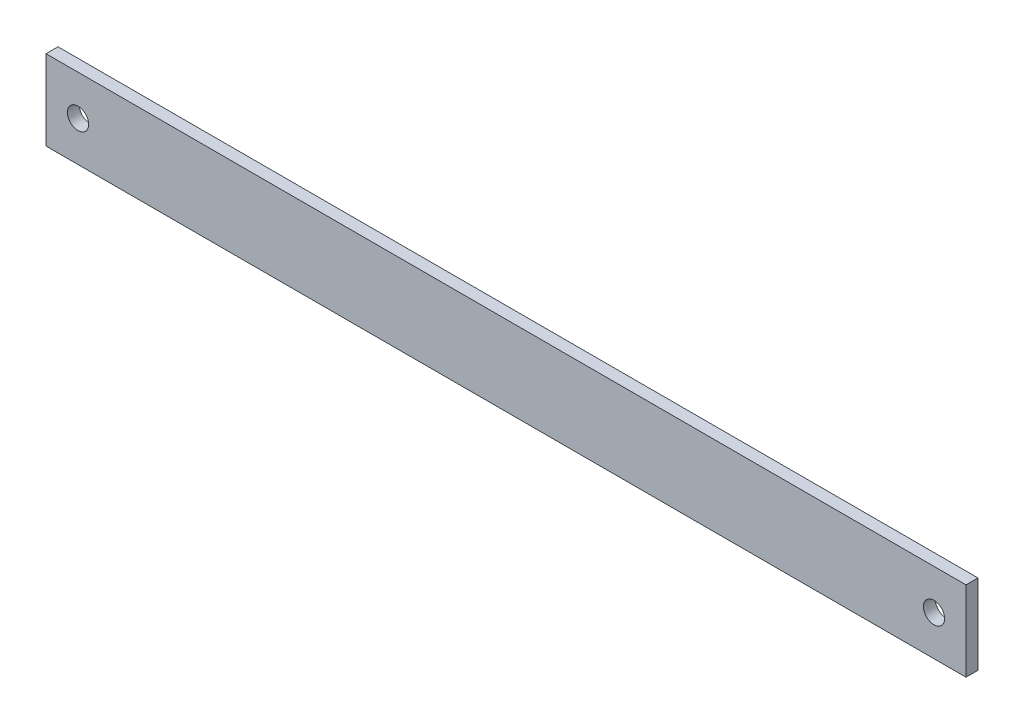
ISO-10303-21;
HEADER;
FILE_DESCRIPTION(('STEP AP214'),'2;1');
FILE_NAME('part.step','',(''),(''),'','','');
FILE_SCHEMA(('AUTOMOTIVE_DESIGN { 1 0 10303 214 1 1 1 1 }'));
ENDSEC;
DATA;
#1=APPLICATION_CONTEXT('core data for automotive mechanical design processes');
#2=APPLICATION_PROTOCOL_DEFINITION('international standard','automotive_design',2000,#1);
#3=PRODUCT_CONTEXT('',#1,'mechanical');
#4=PRODUCT('Part','Part','',(#3));
#5=PRODUCT_RELATED_PRODUCT_CATEGORY('part','',(#4));
#6=PRODUCT_DEFINITION_FORMATION('','',#4);
#7=PRODUCT_DEFINITION_CONTEXT('part definition',#1,'design');
#8=PRODUCT_DEFINITION('design','',#6,#7);
#9=PRODUCT_DEFINITION_SHAPE('','',#8);
#10=(LENGTH_UNIT() NAMED_UNIT(*) SI_UNIT(.MILLI.,.METRE.));
#11=(NAMED_UNIT(*) PLANE_ANGLE_UNIT() SI_UNIT($,.RADIAN.));
#12=(NAMED_UNIT(*) SI_UNIT($,.STERADIAN.) SOLID_ANGLE_UNIT());
#13=UNCERTAINTY_MEASURE_WITH_UNIT(LENGTH_MEASURE(1.E-05),#10,'distance_accuracy_value','');
#14=(GEOMETRIC_REPRESENTATION_CONTEXT(3) GLOBAL_UNCERTAINTY_ASSIGNED_CONTEXT((#13)) GLOBAL_UNIT_ASSIGNED_CONTEXT((#10,
#11,#12)) REPRESENTATION_CONTEXT('',''));
#15=CARTESIAN_POINT('',(0.,0.,0.));
#16=DIRECTION('',(0.,0.,1.));
#17=DIRECTION('',(1.,0.,0.));
#18=AXIS2_PLACEMENT_3D('',#15,#16,#17);
#19=CARTESIAN_POINT('',(-21.25,17.5,-3.));
#20=DIRECTION('',(0.,1.,0.));
#21=DIRECTION('',(-1.,0.,0.));
#22=AXIS2_PLACEMENT_3D('',#19,#20,#21);
#23=PLANE('',#22);
#24=DIRECTION('',(-1.,0.,0.));
#25=VECTOR('',#24,1.);
#26=CARTESIAN_POINT('',(-21.25,17.5,0.));
#27=LINE('',#26,#25);
#28=CARTESIAN_POINT('',(208.75,17.5000000000001,0.));
#29=VERTEX_POINT('',#28);
#30=CARTESIAN_POINT('',(-21.25,17.5,0.));
#31=VERTEX_POINT('',#30);
#32=EDGE_CURVE('E99',#29,#31,#27,.T.);
#33=ORIENTED_EDGE('',*,*,#32,.F.);
#34=DIRECTION('',(0.,0.,1.));
#35=VECTOR('',#34,1.);
#36=CARTESIAN_POINT('',(208.75,17.5000000000001,-3.));
#37=LINE('',#36,#35);
#38=CARTESIAN_POINT('',(208.75,17.5000000000001,-3.));
#39=VERTEX_POINT('',#38);
#40=EDGE_CURVE('E11',#39,#29,#37,.T.);
#41=ORIENTED_EDGE('',*,*,#40,.F.);
#42=DIRECTION('',(-1.,0.,0.));
#43=VECTOR('',#42,1.);
#44=CARTESIAN_POINT('',(-21.25,17.5,-3.));
#45=LINE('',#44,#43);
#46=CARTESIAN_POINT('',(-21.25,17.5,-3.));
#47=VERTEX_POINT('',#46);
#48=EDGE_CURVE('E92',#39,#47,#45,.T.);
#49=ORIENTED_EDGE('',*,*,#48,.T.);
#50=DIRECTION('',(0.,0.,1.));
#51=VECTOR('',#50,1.);
#52=CARTESIAN_POINT('',(-21.25,17.5,-3.));
#53=LINE('',#52,#51);
#54=EDGE_CURVE('E37',#47,#31,#53,.T.);
#55=ORIENTED_EDGE('',*,*,#54,.T.);
#56=EDGE_LOOP('',(#33,#41,#49,#55));
#57=FACE_BOUND('',#56,.T.);
#58=ADVANCED_FACE('F34',(#57),#23,.T.);
#59=CARTESIAN_POINT('',(208.75,17.5000000000001,-3.));
#60=DIRECTION('',(1.,0.,0.));
#61=DIRECTION('',(0.,0.,-1.));
#62=AXIS2_PLACEMENT_3D('',#59,#60,#61);
#63=PLANE('',#62);
#64=DIRECTION('',(0.,1.,0.));
#65=VECTOR('',#64,1.);
#66=CARTESIAN_POINT('',(208.75,17.5000000000001,0.));
#67=LINE('',#66,#65);
#68=CARTESIAN_POINT('',(208.75,-2.5,0.));
#69=VERTEX_POINT('',#68);
#70=EDGE_CURVE('E94',#69,#29,#67,.T.);
#71=ORIENTED_EDGE('',*,*,#70,.F.);
#72=DIRECTION('',(0.,0.,1.));
#73=VECTOR('',#72,1.);
#74=CARTESIAN_POINT('',(208.75,-2.5,-3.));
#75=LINE('',#74,#73);
#76=CARTESIAN_POINT('',(208.75,-2.5,-3.));
#77=VERTEX_POINT('',#76);
#78=EDGE_CURVE('E43',#77,#69,#75,.T.);
#79=ORIENTED_EDGE('',*,*,#78,.F.);
#80=DIRECTION('',(0.,1.,0.));
#81=VECTOR('',#80,1.);
#82=CARTESIAN_POINT('',(208.75,17.5000000000001,-3.));
#83=LINE('',#82,#81);
#84=EDGE_CURVE('E89',#77,#39,#83,.T.);
#85=ORIENTED_EDGE('',*,*,#84,.T.);
#86=ORIENTED_EDGE('',*,*,#40,.T.);
#87=EDGE_LOOP('',(#71,#79,#85,#86));
#88=FACE_BOUND('',#87,.T.);
#89=ADVANCED_FACE('F110',(#88),#63,.T.);
#90=CARTESIAN_POINT('',(-21.25,-2.5,-3.));
#91=DIRECTION('',(0.,-1.,0.));
#92=DIRECTION('',(0.,0.,-1.));
#93=AXIS2_PLACEMENT_3D('',#90,#91,#92);
#94=PLANE('',#93);
#95=DIRECTION('',(1.,0.,0.));
#96=VECTOR('',#95,1.);
#97=CARTESIAN_POINT('',(-21.25,-2.5,0.));
#98=LINE('',#97,#96);
#99=CARTESIAN_POINT('',(-21.25,-2.5,0.));
#100=VERTEX_POINT('',#99);
#101=EDGE_CURVE('E84',#100,#69,#98,.T.);
#102=ORIENTED_EDGE('',*,*,#101,.F.);
#103=DIRECTION('',(0.,0.,1.));
#104=VECTOR('',#103,1.);
#105=CARTESIAN_POINT('',(-21.25,-2.5,-3.));
#106=LINE('',#105,#104);
#107=CARTESIAN_POINT('',(-21.25,-2.5,-3.));
#108=VERTEX_POINT('',#107);
#109=EDGE_CURVE('E79',#108,#100,#106,.T.);
#110=ORIENTED_EDGE('',*,*,#109,.F.);
#111=DIRECTION('',(1.,0.,0.));
#112=VECTOR('',#111,1.);
#113=CARTESIAN_POINT('',(-21.25,-2.5,-3.));
#114=LINE('',#113,#112);
#115=EDGE_CURVE('E82',#108,#77,#114,.T.);
#116=ORIENTED_EDGE('',*,*,#115,.T.);
#117=ORIENTED_EDGE('',*,*,#78,.T.);
#118=EDGE_LOOP('',(#102,#110,#116,#117));
#119=FACE_BOUND('',#118,.T.);
#120=ADVANCED_FACE('F81',(#119),#94,.T.);
#121=CARTESIAN_POINT('',(-21.25,17.5,-3.));
#122=DIRECTION('',(-1.,0.,0.));
#123=DIRECTION('',(0.,0.,1.));
#124=AXIS2_PLACEMENT_3D('',#121,#122,#123);
#125=PLANE('',#124);
#126=DIRECTION('',(0.,-1.,0.));
#127=VECTOR('',#126,1.);
#128=CARTESIAN_POINT('',(-21.25,17.5,0.));
#129=LINE('',#128,#127);
#130=EDGE_CURVE('E102',#31,#100,#129,.T.);
#131=ORIENTED_EDGE('',*,*,#130,.F.);
#132=ORIENTED_EDGE('',*,*,#54,.F.);
#133=DIRECTION('',(0.,-1.,0.));
#134=VECTOR('',#133,1.);
#135=CARTESIAN_POINT('',(-21.25,17.5,-3.));
#136=LINE('',#135,#134);
#137=EDGE_CURVE('E88',#47,#108,#136,.T.);
#138=ORIENTED_EDGE('',*,*,#137,.T.);
#139=ORIENTED_EDGE('',*,*,#109,.T.);
#140=EDGE_LOOP('',(#131,#132,#138,#139));
#141=FACE_BOUND('',#140,.T.);
#142=ADVANCED_FACE('F91',(#141),#125,.T.);
#143=CARTESIAN_POINT('',(0.,0.,-3.));
#144=DIRECTION('',(0.,0.,-1.));
#145=DIRECTION('',(-1.,0.,0.));
#146=AXIS2_PLACEMENT_3D('',#143,#144,#145);
#147=PLANE('',#146);
#148=CARTESIAN_POINT('',(200.75,7.50000000000004,-3.));
#149=DIRECTION('',(0.,0.,1.));
#150=DIRECTION('',(1.,0.,0.));
#151=AXIS2_PLACEMENT_3D('',#148,#149,#150);
#152=CIRCLE('',#151,2.65000000000001);
#153=CARTESIAN_POINT('',(203.4,7.50000000000004,-3.));
#154=VERTEX_POINT('',#153);
#155=EDGE_CURVE('E143',#154,#154,#152,.T.);
#156=ORIENTED_EDGE('',*,*,#155,.T.);
#157=EDGE_LOOP('',(#156));
#158=FACE_BOUND('',#157,.T.);
#159=CARTESIAN_POINT('',(-13.25,7.5,-3.));
#160=DIRECTION('',(0.,0.,1.));
#161=DIRECTION('',(1.,0.,0.));
#162=AXIS2_PLACEMENT_3D('',#159,#160,#161);
#163=CIRCLE('',#162,2.65);
#164=CARTESIAN_POINT('',(-10.6,7.5,-3.));
#165=VERTEX_POINT('',#164);
#166=EDGE_CURVE('E103',#165,#165,#163,.T.);
#167=ORIENTED_EDGE('',*,*,#166,.T.);
#168=EDGE_LOOP('',(#167));
#169=FACE_BOUND('',#168,.T.);
#170=ORIENTED_EDGE('',*,*,#48,.F.);
#171=ORIENTED_EDGE('',*,*,#84,.F.);
#172=ORIENTED_EDGE('',*,*,#115,.F.);
#173=ORIENTED_EDGE('',*,*,#137,.F.);
#174=EDGE_LOOP('',(#170,#171,#172,#173));
#175=FACE_BOUND('',#174,.T.);
#176=ADVANCED_FACE('F87',(#158,#169,#175),#147,.T.);
#177=CARTESIAN_POINT('',(0.,0.,0.));
#178=DIRECTION('',(0.,0.,-1.));
#179=DIRECTION('',(-1.,0.,0.));
#180=AXIS2_PLACEMENT_3D('',#177,#178,#179);
#181=PLANE('',#180);
#182=CARTESIAN_POINT('',(200.75,7.50000000000004,0.));
#183=DIRECTION('',(0.,0.,1.));
#184=DIRECTION('',(1.,0.,0.));
#185=AXIS2_PLACEMENT_3D('',#182,#183,#184);
#186=CIRCLE('',#185,2.65000000000001);
#187=CARTESIAN_POINT('',(203.4,7.50000000000004,0.));
#188=VERTEX_POINT('',#187);
#189=EDGE_CURVE('E146',#188,#188,#186,.T.);
#190=ORIENTED_EDGE('',*,*,#189,.F.);
#191=EDGE_LOOP('',(#190));
#192=FACE_BOUND('',#191,.T.);
#193=CARTESIAN_POINT('',(-13.25,7.5,0.));
#194=DIRECTION('',(0.,0.,1.));
#195=DIRECTION('',(1.,0.,0.));
#196=AXIS2_PLACEMENT_3D('',#193,#194,#195);
#197=CIRCLE('',#196,2.65);
#198=CARTESIAN_POINT('',(-10.6,7.5,0.));
#199=VERTEX_POINT('',#198);
#200=EDGE_CURVE('E148',#199,#199,#197,.T.);
#201=ORIENTED_EDGE('',*,*,#200,.F.);
#202=EDGE_LOOP('',(#201));
#203=FACE_BOUND('',#202,.T.);
#204=ORIENTED_EDGE('',*,*,#32,.T.);
#205=ORIENTED_EDGE('',*,*,#130,.T.);
#206=ORIENTED_EDGE('',*,*,#101,.T.);
#207=ORIENTED_EDGE('',*,*,#70,.T.);
#208=EDGE_LOOP('',(#204,#205,#206,#207));
#209=FACE_BOUND('',#208,.T.);
#210=ADVANCED_FACE('F109',(#192,#203,#209),#181,.F.);
#211=CARTESIAN_POINT('',(-13.25,7.5,-3.));
#212=DIRECTION('',(0.,0.,1.));
#213=DIRECTION('',(1.,0.,0.));
#214=AXIS2_PLACEMENT_3D('',#211,#212,#213);
#215=CYLINDRICAL_SURFACE('',#214,2.65);
#216=ORIENTED_EDGE('',*,*,#166,.F.);
#217=EDGE_LOOP('',(#216));
#218=FACE_BOUND('',#217,.T.);
#219=ORIENTED_EDGE('',*,*,#200,.T.);
#220=EDGE_LOOP('',(#219));
#221=FACE_BOUND('',#220,.T.);
#222=ADVANCED_FACE('F128',(#218,#221),#215,.F.);
#223=CARTESIAN_POINT('',(200.75,7.50000000000004,-3.));
#224=DIRECTION('',(0.,0.,1.));
#225=DIRECTION('',(1.,0.,0.));
#226=AXIS2_PLACEMENT_3D('',#223,#224,#225);
#227=CYLINDRICAL_SURFACE('',#226,2.65000000000001);
#228=ORIENTED_EDGE('',*,*,#155,.F.);
#229=EDGE_LOOP('',(#228));
#230=FACE_BOUND('',#229,.T.);
#231=ORIENTED_EDGE('',*,*,#189,.T.);
#232=EDGE_LOOP('',(#231));
#233=FACE_BOUND('',#232,.T.);
#234=ADVANCED_FACE('F135',(#230,#233),#227,.F.);
#235=CLOSED_SHELL('',(#58,#89,#120,#142,#176,#210,#222,#234));
#236=MANIFOLD_SOLID_BREP('B2',#235);
#237=ADVANCED_BREP_SHAPE_REPRESENTATION('',(#18,#236),#14);
#238=SHAPE_DEFINITION_REPRESENTATION(#9,#237);
ENDSEC;
END-ISO-10303-21;
